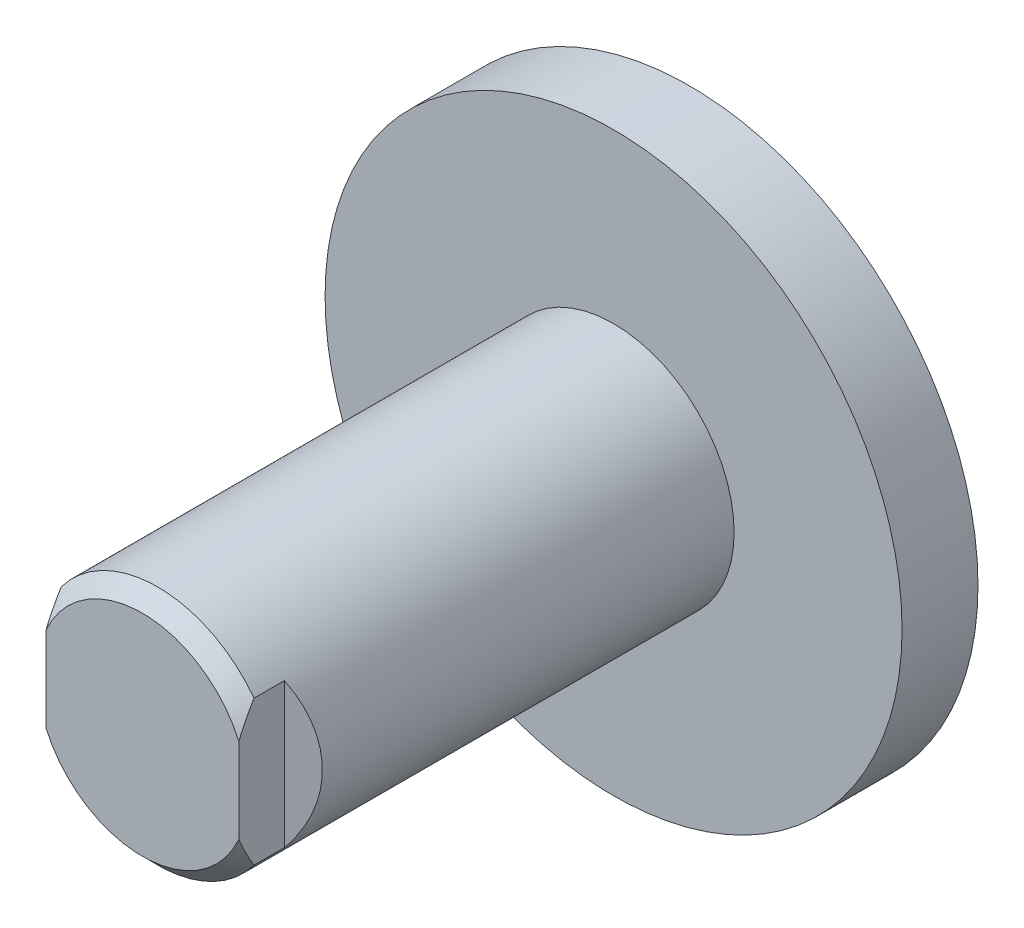
ISO-10303-21;
HEADER;
FILE_DESCRIPTION(('STEP AP214'),'2;1');
FILE_NAME('part.step','',(''),(''),'','','');
FILE_SCHEMA(('AUTOMOTIVE_DESIGN { 1 0 10303 214 1 1 1 1 }'));
ENDSEC;
DATA;
#1=APPLICATION_CONTEXT('core data for automotive mechanical design processes');
#2=APPLICATION_PROTOCOL_DEFINITION('international standard','automotive_design',2000,#1);
#3=PRODUCT_CONTEXT('',#1,'mechanical');
#4=PRODUCT('Part','Part','',(#3));
#5=PRODUCT_RELATED_PRODUCT_CATEGORY('part','',(#4));
#6=PRODUCT_DEFINITION_FORMATION('','',#4);
#7=PRODUCT_DEFINITION_CONTEXT('part definition',#1,'design');
#8=PRODUCT_DEFINITION('design','',#6,#7);
#9=PRODUCT_DEFINITION_SHAPE('','',#8);
#10=(LENGTH_UNIT() NAMED_UNIT(*) SI_UNIT(.MILLI.,.METRE.));
#11=(NAMED_UNIT(*) PLANE_ANGLE_UNIT() SI_UNIT($,.RADIAN.));
#12=(NAMED_UNIT(*) SI_UNIT($,.STERADIAN.) SOLID_ANGLE_UNIT());
#13=UNCERTAINTY_MEASURE_WITH_UNIT(LENGTH_MEASURE(1.E-05),#10,'distance_accuracy_value','');
#14=(GEOMETRIC_REPRESENTATION_CONTEXT(3) GLOBAL_UNCERTAINTY_ASSIGNED_CONTEXT((#13)) GLOBAL_UNIT_ASSIGNED_CONTEXT((#10,
#11,#12)) REPRESENTATION_CONTEXT('',''));
#15=CARTESIAN_POINT('',(0.,0.,0.));
#16=DIRECTION('',(0.,0.,1.));
#17=DIRECTION('',(1.,0.,0.));
#18=AXIS2_PLACEMENT_3D('',#15,#16,#17);
#19=CARTESIAN_POINT('',(0.,0.,36.028));
#20=DIRECTION('',(0.,0.,-1.));
#21=DIRECTION('',(-1.,0.,0.));
#22=AXIS2_PLACEMENT_3D('',#19,#20,#21);
#23=CONICAL_SURFACE('',#22,6.93750000000001,0.785398163397447);
#24=CARTESIAN_POINT('',(6.35,16.2875136785808,25.4839210715978));
#25=CARTESIAN_POINT('',(6.35,16.038699829321,25.7157353459383));
#26=CARTESIAN_POINT('',(6.35,15.7895411600218,25.9471797249323));
#27=CARTESIAN_POINT('',(6.35,15.2904267892255,26.4092107058505));
#28=CARTESIAN_POINT('',(6.35,15.0404710823884,26.6397973020049));
#29=CARTESIAN_POINT('',(6.35,14.2891413353907,27.3301907662454));
#30=CARTESIAN_POINT('',(6.35,13.7864148671968,27.7885284472054));
#31=CARTESIAN_POINT('',(6.35,12.7728274447878,28.7029853571437));
#32=CARTESIAN_POINT('',(6.35,12.2619345883602,29.1590693340857));
#33=CARTESIAN_POINT('',(6.35,11.4906737015637,29.8375432163965));
#34=CARTESIAN_POINT('',(6.35,11.2327816159887,30.0627462284449));
#35=CARTESIAN_POINT('',(6.35,10.7150320001923,30.5108776744459));
#36=CARTESIAN_POINT('',(6.35,10.4551744790402,30.733806118883));
#37=CARTESIAN_POINT('',(6.35,9.77649272816618,31.3098906516772));
#38=CARTESIAN_POINT('',(6.35,9.35584899718606,31.6609184741951));
#39=CARTESIAN_POINT('',(6.35,8.71878318362883,32.1801083902643));
#40=CARTESIAN_POINT('',(6.35,8.50537724289282,32.3519727845363));
#41=CARTESIAN_POINT('',(6.35,8.07619038561178,32.6927066917316));
#42=CARTESIAN_POINT('',(6.35,7.86040952182965,32.8615762709729));
#43=CARTESIAN_POINT('',(6.35,7.42637877070531,33.1954232195357));
#44=CARTESIAN_POINT('',(6.35,7.20813318082368,33.3604061645147));
#45=CARTESIAN_POINT('',(6.35,6.76831667735438,33.6859135195119));
#46=CARTESIAN_POINT('',(6.35,6.54674560881686,33.8464377207763));
#47=CARTESIAN_POINT('',(6.35,6.09976514084821,34.1618327397354));
#48=CARTESIAN_POINT('',(6.35,5.87435768071116,34.3167062962453));
#49=CARTESIAN_POINT('',(6.35,5.41886417025182,34.6193868262733));
#50=CARTESIAN_POINT('',(6.35,5.18877874327596,34.7671947326175));
#51=CARTESIAN_POINT('',(6.35,4.74477755368256,35.0403675353787));
#52=CARTESIAN_POINT('',(6.35,4.53136033772533,35.1665388833678));
#53=CARTESIAN_POINT('',(6.35,4.09916097803645,35.4094652463566));
#54=CARTESIAN_POINT('',(6.35,3.88037825520523,35.5262192390558));
#55=CARTESIAN_POINT('',(6.35,3.43683978608304,35.7476432552944));
#56=CARTESIAN_POINT('',(6.35,3.21208651504474,35.8523181932432));
#57=CARTESIAN_POINT('',(6.35,2.75600057303171,36.0462884448741));
#58=CARTESIAN_POINT('',(6.35,2.52466959520766,36.1355876753606));
#59=CARTESIAN_POINT('',(6.35,2.10441967881809,36.2781520285778));
#60=CARTESIAN_POINT('',(6.35,1.91673984159241,36.3350476370142));
#61=CARTESIAN_POINT('',(6.35,1.53760010890187,36.4345518111373));
#62=CARTESIAN_POINT('',(6.35,1.3461406735311,36.477162104571));
#63=CARTESIAN_POINT('',(6.35,0.960928289736163,36.5459888656755));
#64=CARTESIAN_POINT('',(6.35,0.767185378244099,36.5722606949186));
#65=CARTESIAN_POINT('',(6.35,0.378104473623389,36.6072025803939));
#66=CARTESIAN_POINT('',(6.35,0.182766584658941,36.6158737769953));
#67=CARTESIAN_POINT('',(6.35,-0.208522682761337,36.6151001222563));
#68=CARTESIAN_POINT('',(6.35,-0.404473942190867,36.6055949578497));
#69=CARTESIAN_POINT('',(6.35,-0.79470211208349,36.5689155875695));
#70=CARTESIAN_POINT('',(6.35,-0.988978893112245,36.5417400279978));
#71=CARTESIAN_POINT('',(6.35,-1.37513590408204,36.4710929882338));
#72=CARTESIAN_POINT('',(6.35,-1.5670066284985,36.427570317876));
#73=CARTESIAN_POINT('',(6.35,-1.94690603737092,36.3262682952685));
#74=CARTESIAN_POINT('',(6.35,-2.13493449709389,36.2684881116707));
#75=CARTESIAN_POINT('',(6.35,-2.52392668494941,36.134957599593));
#76=CARTESIAN_POINT('',(6.35,-2.72448692150156,36.0580423713275));
#77=CARTESIAN_POINT('',(6.35,-3.12070545432217,35.892389904449));
#78=CARTESIAN_POINT('',(6.35,-3.31636168916989,35.8036477901771));
#79=CARTESIAN_POINT('',(6.35,-3.703329426898,35.6164575687577));
#80=CARTESIAN_POINT('',(6.35,-3.89463339748388,35.5179940079799));
#81=CARTESIAN_POINT('',(6.35,-4.27299973573859,35.3133294724268));
#82=CARTESIAN_POINT('',(6.35,-4.46006261935477,35.2071294455223));
#83=CARTESIAN_POINT('',(6.35,-4.83285571275848,34.9870243818965));
#84=CARTESIAN_POINT('',(6.35,-5.01853730571334,34.8730373850988));
#85=CARTESIAN_POINT('',(6.35,-5.38655834031441,34.6398014693271));
#86=CARTESIAN_POINT('',(6.35,-5.56889770782549,34.5205524338334));
#87=CARTESIAN_POINT('',(6.35,-5.9304931327282,34.2778473642052));
#88=CARTESIAN_POINT('',(6.35,-6.10975197247163,34.1543954631431));
#89=CARTESIAN_POINT('',(6.35,-6.46574267140388,33.9039140416613));
#90=CARTESIAN_POINT('',(6.35,-6.64247456104409,33.7768845644085));
#91=CARTESIAN_POINT('',(6.35,-7.03526800028357,33.4894473701004));
#92=CARTESIAN_POINT('',(6.35,-7.25074985996656,33.3282484164257));
#93=CARTESIAN_POINT('',(6.35,-7.67888929274281,33.0021361536938));
#94=CARTESIAN_POINT('',(6.35,-7.8915467571331,32.8372227023308));
#95=CARTESIAN_POINT('',(6.35,-8.31448714661407,32.5043252678482));
#96=CARTESIAN_POINT('',(6.35,-8.52476974954855,32.3363408760525));
#97=CARTESIAN_POINT('',(6.35,-8.94328351667761,31.9978333175353));
#98=CARTESIAN_POINT('',(6.35,-9.15151464764662,31.8273101098072));
#99=CARTESIAN_POINT('',(6.35,-9.77400270901999,31.3122139192935));
#100=CARTESIAN_POINT('',(6.35,-10.1856241437372,30.9644557576852));
#101=CARTESIAN_POINT('',(6.35,-11.0036169219832,30.262821103185));
#102=CARTESIAN_POINT('',(6.35,-11.4099881026738,29.9089444213174));
#103=CARTESIAN_POINT('',(6.35,-12.1929114867335,29.2193184992231));
#104=CARTESIAN_POINT('',(6.35,-12.569713045057,28.8838519182819));
#105=CARTESIAN_POINT('',(6.35,-13.3205119247593,28.2097808477907));
#106=CARTESIAN_POINT('',(6.35,-13.6945091766494,27.8711762809455));
#107=CARTESIAN_POINT('',(6.35,-14.4393981075081,27.1922559620584));
#108=CARTESIAN_POINT('',(6.35,-14.8102948961108,26.8519458096565));
#109=CARTESIAN_POINT('',(6.35,-15.5502102709245,26.1693250218552));
#110=CARTESIAN_POINT('',(6.35,-15.9192289477531,25.8270144847183));
#111=CARTESIAN_POINT('',(6.35,-16.2875136785808,25.4839210715978));
#112=B_SPLINE_CURVE_WITH_KNOTS('',3,(#24,#25,#26,#27,#28,#29,#30,#31,#32,#33,#34,#35,#36,#37,
#38,#39,#40,#41,#42,#43,#44,#45,#46,#47,#48,#49,#50,#51,#52,#53,#54,#55,#56,#57,#58,#59,#60,#61,
#62,#63,#64,#65,#66,#67,#68,#69,#70,#71,#72,#73,#74,#75,#76,#77,#78,#79,#80,#81,#82,#83,#84,#85,
#86,#87,#88,#89,#90,#91,#92,#93,#94,#95,#96,#97,#98,#99,#100,#101,#102,#103,#104,#105,#106,#107,
#108,#109,#110,#111),.UNSPECIFIED.,.F.,.F.,(4,2,2,2,2,2,2,2,2,2,2,2,2,2,2,2,2,2,2,2,2,2,2,2,2,2,
2,2,2,2,2,2,2,2,2,2,2,2,2,2,2,2,2,4),(0.,1.0202033697665,2.04041358921686,4.08128625592998,
6.13578721730724,7.16291821623865,8.1900444785181,9.8335258846749,10.6555246052456,
11.4775051004518,12.2982240967918,13.1189814537867,13.9393355645477,14.7595810691226,
15.5031658225327,16.2468311874066,16.9901929144176,17.7333649965589,18.3212353484725,
18.9090345743392,19.4948310801572,20.0805896302035,20.6682952260422,21.2560458502851,
21.845652542485,22.4352936224741,23.0792378011829,23.7234482731973,24.3686998229871,
25.0138724491743,25.6673987859642,26.3209396013644,26.9738553081913,27.6267631403172,
28.4340267527635,29.2413213449869,30.0487241643054,30.8561400388648,32.4726189438642,
34.0891478646706,35.6026166746318,37.1161228641523,38.6262071736647,40.1362179183782),.UNSPECIFIED.);
#113=CARTESIAN_POINT('',(6.35,4.7625,35.028));
#114=VERTEX_POINT('',#113);
#115=CARTESIAN_POINT('',(6.35,2.79399467608655,36.028));
#116=VERTEX_POINT('',#115);
#117=EDGE_CURVE('E43',#114,#116,#112,.T.);
#118=ORIENTED_EDGE('',*,*,#117,.F.);
#119=CARTESIAN_POINT('',(0.,0.,35.028));
#120=DIRECTION('',(0.,0.,-1.));
#121=DIRECTION('',(-1.,0.,0.));
#122=AXIS2_PLACEMENT_3D('',#119,#120,#121);
#123=CIRCLE('',#122,7.9375);
#124=CARTESIAN_POINT('',(-6.35,4.7625,35.028));
#125=VERTEX_POINT('',#124);
#126=EDGE_CURVE('E113',#125,#114,#123,.T.);
#127=ORIENTED_EDGE('',*,*,#126,.F.);
#128=CARTESIAN_POINT('',(-6.35,-16.2875136785808,25.4839210715978));
#129=CARTESIAN_POINT('',(-6.35,-16.038699829321,25.7157353459383));
#130=CARTESIAN_POINT('',(-6.35,-15.7895411600218,25.9471797249323));
#131=CARTESIAN_POINT('',(-6.35,-15.2904267892255,26.4092107058505));
#132=CARTESIAN_POINT('',(-6.35,-15.0404710823884,26.6397973020049));
#133=CARTESIAN_POINT('',(-6.35,-14.2891413353907,27.3301907662454));
#134=CARTESIAN_POINT('',(-6.35,-13.7864148671968,27.7885284472054));
#135=CARTESIAN_POINT('',(-6.35,-12.7728274447878,28.7029853571437));
#136=CARTESIAN_POINT('',(-6.35,-12.2619345883602,29.1590693340857));
#137=CARTESIAN_POINT('',(-6.35,-11.4906737015637,29.8375432163964));
#138=CARTESIAN_POINT('',(-6.35,-11.2327816159887,30.0627462284449));
#139=CARTESIAN_POINT('',(-6.35,-10.7150320001923,30.5108776744459));
#140=CARTESIAN_POINT('',(-6.35,-10.4551744790402,30.7338061188829));
#141=CARTESIAN_POINT('',(-6.35,-9.77649272816619,31.3098906516772));
#142=CARTESIAN_POINT('',(-6.35,-9.35584899718607,31.6609184741951));
#143=CARTESIAN_POINT('',(-6.35,-8.71878318362885,32.1801083902643));
#144=CARTESIAN_POINT('',(-6.35,-8.50537724289284,32.3519727845363));
#145=CARTESIAN_POINT('',(-6.35,-8.0761903856118,32.6927066917316));
#146=CARTESIAN_POINT('',(-6.35,-7.86040952182968,32.8615762709729));
#147=CARTESIAN_POINT('',(-6.35,-7.42637877070534,33.1954232195357));
#148=CARTESIAN_POINT('',(-6.35,-7.20813318082371,33.3604061645147));
#149=CARTESIAN_POINT('',(-6.35,-6.76831667735441,33.6859135195118));
#150=CARTESIAN_POINT('',(-6.35,-6.54674560881689,33.8464377207763));
#151=CARTESIAN_POINT('',(-6.35,-6.09976514084825,34.1618327397354));
#152=CARTESIAN_POINT('',(-6.35,-5.87435768071121,34.3167062962453));
#153=CARTESIAN_POINT('',(-6.35,-5.41886417025187,34.6193868262732));
#154=CARTESIAN_POINT('',(-6.35,-5.18877874327601,34.7671947326175));
#155=CARTESIAN_POINT('',(-6.35,-4.74477755368262,35.0403675353786));
#156=CARTESIAN_POINT('',(-6.35,-4.53136033772538,35.1665388833678));
#157=CARTESIAN_POINT('',(-6.35,-4.09916097803651,35.4094652463566));
#158=CARTESIAN_POINT('',(-6.35,-3.88037825520528,35.5262192390558));
#159=CARTESIAN_POINT('',(-6.35,-3.43683978608309,35.7476432552944));
#160=CARTESIAN_POINT('',(-6.35,-3.21208651504479,35.8523181932432));
#161=CARTESIAN_POINT('',(-6.35,-2.75600057303176,36.0462884448741));
#162=CARTESIAN_POINT('',(-6.35,-2.52466959520771,36.1355876753606));
#163=CARTESIAN_POINT('',(-6.35,-2.10441967881813,36.2781520285778));
#164=CARTESIAN_POINT('',(-6.35,-1.91673984159246,36.3350476370142));
#165=CARTESIAN_POINT('',(-6.35,-1.53760010890192,36.4345518111373));
#166=CARTESIAN_POINT('',(-6.35,-1.34614067353114,36.4771621045709));
#167=CARTESIAN_POINT('',(-6.35,-0.9609282897362,36.5459888656755));
#168=CARTESIAN_POINT('',(-6.35,-0.767185378244136,36.5722606949186));
#169=CARTESIAN_POINT('',(-6.35,-0.378104473623426,36.6072025803939));
#170=CARTESIAN_POINT('',(-6.35,-0.182766584658978,36.6158737769953));
#171=CARTESIAN_POINT('',(-6.35,0.2085226827613,36.6151001222563));
#172=CARTESIAN_POINT('',(-6.35,0.404473942190831,36.6055949578497));
#173=CARTESIAN_POINT('',(-6.35,0.794702112083457,36.5689155875695));
#174=CARTESIAN_POINT('',(-6.35,0.988978893112213,36.5417400279978));
#175=CARTESIAN_POINT('',(-6.35,1.37513590408201,36.4710929882338));
#176=CARTESIAN_POINT('',(-6.35,1.56700662849848,36.427570317876));
#177=CARTESIAN_POINT('',(-6.35,1.9469060373709,36.3262682952686));
#178=CARTESIAN_POINT('',(-6.35,2.13493449709386,36.2684881116707));
#179=CARTESIAN_POINT('',(-6.35,2.52392668494938,36.134957599593));
#180=CARTESIAN_POINT('',(-6.35,2.72448692150153,36.0580423713275));
#181=CARTESIAN_POINT('',(-6.35,3.12070545432214,35.892389904449));
#182=CARTESIAN_POINT('',(-6.35,3.31636168916986,35.8036477901771));
#183=CARTESIAN_POINT('',(-6.35,3.70332942689797,35.6164575687577));
#184=CARTESIAN_POINT('',(-6.35,3.89463339748385,35.5179940079799));
#185=CARTESIAN_POINT('',(-6.35,4.27299973573855,35.3133294724268));
#186=CARTESIAN_POINT('',(-6.35,4.46006261935472,35.2071294455223));
#187=CARTESIAN_POINT('',(-6.35,4.83285571275843,34.9870243818965));
#188=CARTESIAN_POINT('',(-6.35,5.01853730571329,34.8730373850988));
#189=CARTESIAN_POINT('',(-6.35,5.38655834031436,34.6398014693272));
#190=CARTESIAN_POINT('',(-6.35,5.56889770782544,34.5205524338334));
#191=CARTESIAN_POINT('',(-6.35,5.93049313272815,34.2778473642052));
#192=CARTESIAN_POINT('',(-6.35,6.10975197247157,34.1543954631432));
#193=CARTESIAN_POINT('',(-6.35,6.46574267140382,33.9039140416614));
#194=CARTESIAN_POINT('',(-6.35,6.64247456104403,33.7768845644086));
#195=CARTESIAN_POINT('',(-6.35,7.03526800028351,33.4894473701005));
#196=CARTESIAN_POINT('',(-6.35,7.2507498599665,33.3282484164258));
#197=CARTESIAN_POINT('',(-6.35,7.67888929274275,33.0021361536939));
#198=CARTESIAN_POINT('',(-6.35,7.89154675713304,32.8372227023309));
#199=CARTESIAN_POINT('',(-6.35,8.31448714661401,32.5043252678483));
#200=CARTESIAN_POINT('',(-6.35,8.5247697495485,32.3363408760526));
#201=CARTESIAN_POINT('',(-6.35,8.94328351667757,31.9978333175354));
#202=CARTESIAN_POINT('',(-6.35,9.15151464764657,31.8273101098072));
#203=CARTESIAN_POINT('',(-6.35,9.77400270901994,31.3122139192935));
#204=CARTESIAN_POINT('',(-6.35,10.1856241437372,30.9644557576852));
#205=CARTESIAN_POINT('',(-6.35,11.0036169219832,30.262821103185));
#206=CARTESIAN_POINT('',(-6.35,11.4099881026738,29.9089444213175));
#207=CARTESIAN_POINT('',(-6.35,12.1929114867335,29.2193184992232));
#208=CARTESIAN_POINT('',(-6.35,12.569713045057,28.883851918282));
#209=CARTESIAN_POINT('',(-6.35,13.3205119247593,28.2097808477908));
#210=CARTESIAN_POINT('',(-6.35,13.6945091766493,27.8711762809455));
#211=CARTESIAN_POINT('',(-6.35,14.4393981075081,27.1922559620585));
#212=CARTESIAN_POINT('',(-6.35,14.8102948961108,26.8519458096565));
#213=CARTESIAN_POINT('',(-6.35,15.5502102709245,26.1693250218552));
#214=CARTESIAN_POINT('',(-6.35,15.9192289477531,25.8270144847183));
#215=CARTESIAN_POINT('',(-6.35,16.2875136785808,25.4839210715978));
#216=B_SPLINE_CURVE_WITH_KNOTS('',3,(#128,#129,#130,#131,#132,#133,#134,#135,#136,#137,#138,
#139,#140,#141,#142,#143,#144,#145,#146,#147,#148,#149,#150,#151,#152,#153,#154,#155,#156,#157,
#158,#159,#160,#161,#162,#163,#164,#165,#166,#167,#168,#169,#170,#171,#172,#173,#174,#175,#176,
#177,#178,#179,#180,#181,#182,#183,#184,#185,#186,#187,#188,#189,#190,#191,#192,#193,#194,#195,
#196,#197,#198,#199,#200,#201,#202,#203,#204,#205,#206,#207,#208,#209,#210,#211,#212,#213,#214,
#215),.UNSPECIFIED.,.F.,.F.,(4,2,2,2,2,2,2,2,2,2,2,2,2,2,2,2,2,2,2,2,2,2,2,2,2,2,2,2,2,2,2,2,2,
2,2,2,2,2,2,2,2,2,2,4),(0.,1.0202033697665,2.04041358921686,4.08128625592997,6.13578721730723,
7.16291821623864,8.19004447851809,9.83352588467488,10.6555246052456,11.4775051004517,
12.2982240967918,13.1189814537867,13.9393355645477,14.7595810691225,15.5031658225326,
16.2468311874066,16.9901929144175,17.7333649965588,18.3212353484725,18.9090345743391,
19.4948310801572,20.0805896302034,20.6682952260422,21.256045850285,21.845652542485,
22.4352936224741,23.0792378011828,23.7234482731973,24.368699822987,25.0138724491742,
25.6673987859641,26.3209396013644,26.9738553081912,27.6267631403172,28.4340267527635,
29.2413213449868,30.0487241643053,30.8561400388647,32.4726189438642,34.0891478646705,
35.6026166746318,37.1161228641523,38.6262071736647,40.1362179183782),.UNSPECIFIED.);
#217=CARTESIAN_POINT('',(-6.35000000000002,2.79399467608652,36.028));
#218=VERTEX_POINT('',#217);
#219=EDGE_CURVE('E102',#218,#125,#216,.T.);
#220=ORIENTED_EDGE('',*,*,#219,.F.);
#221=CARTESIAN_POINT('',(0.,0.,36.028));
#222=DIRECTION('',(0.,0.,-1.));
#223=DIRECTION('',(-1.,0.,0.));
#224=AXIS2_PLACEMENT_3D('',#221,#222,#223);
#225=CIRCLE('',#224,6.93750000000001);
#226=EDGE_CURVE('E57',#116,#218,#225,.F.);
#227=ORIENTED_EDGE('',*,*,#226,.F.);
#228=EDGE_LOOP('',(#118,#127,#220,#227));
#229=FACE_BOUND('',#228,.T.);
#230=ADVANCED_FACE('F34',(#229),#23,.T.);
#231=CARTESIAN_POINT('',(0.,0.,5.));
#232=DIRECTION('',(0.,0.,-1.));
#233=DIRECTION('',(-1.,0.,0.));
#234=AXIS2_PLACEMENT_3D('',#231,#232,#233);
#235=CYLINDRICAL_SURFACE('',#234,19.);
#236=CARTESIAN_POINT('',(0.,0.,5.));
#237=DIRECTION('',(0.,0.,1.));
#238=DIRECTION('',(1.,0.,0.));
#239=AXIS2_PLACEMENT_3D('',#236,#237,#238);
#240=CIRCLE('',#239,19.);
#241=CARTESIAN_POINT('',(19.,0.,5.));
#242=VERTEX_POINT('',#241);
#243=EDGE_CURVE('E107',#242,#242,#240,.T.);
#244=ORIENTED_EDGE('',*,*,#243,.F.);
#245=EDGE_LOOP('',(#244));
#246=FACE_BOUND('',#245,.T.);
#247=CARTESIAN_POINT('',(0.,0.,0.));
#248=DIRECTION('',(0.,0.,1.));
#249=DIRECTION('',(1.,0.,0.));
#250=AXIS2_PLACEMENT_3D('',#247,#248,#249);
#251=CIRCLE('',#250,19.);
#252=CARTESIAN_POINT('',(19.,0.,0.));
#253=VERTEX_POINT('',#252);
#254=EDGE_CURVE('E111',#253,#253,#251,.T.);
#255=ORIENTED_EDGE('',*,*,#254,.T.);
#256=EDGE_LOOP('',(#255));
#257=FACE_BOUND('',#256,.T.);
#258=ADVANCED_FACE('F144',(#246,#257),#235,.T.);
#259=CARTESIAN_POINT('',(0.,0.,5.));
#260=DIRECTION('',(0.,0.,1.));
#261=DIRECTION('',(1.,0.,0.));
#262=AXIS2_PLACEMENT_3D('',#259,#260,#261);
#263=PLANE('',#262);
#264=CARTESIAN_POINT('',(0.,0.,5.));
#265=DIRECTION('',(0.,0.,1.));
#266=DIRECTION('',(1.,0.,0.));
#267=AXIS2_PLACEMENT_3D('',#264,#265,#266);
#268=CIRCLE('',#267,7.9375);
#269=CARTESIAN_POINT('',(7.9375,0.,5.));
#270=VERTEX_POINT('',#269);
#271=EDGE_CURVE('E103',#270,#270,#268,.T.);
#272=ORIENTED_EDGE('',*,*,#271,.F.);
#273=EDGE_LOOP('',(#272));
#274=FACE_BOUND('',#273,.T.);
#275=ORIENTED_EDGE('',*,*,#243,.T.);
#276=EDGE_LOOP('',(#275));
#277=FACE_BOUND('',#276,.T.);
#278=ADVANCED_FACE('F141',(#274,#277),#263,.T.);
#279=CARTESIAN_POINT('',(0.,0.,0.));
#280=DIRECTION('',(0.,0.,1.));
#281=DIRECTION('',(1.,0.,0.));
#282=AXIS2_PLACEMENT_3D('',#279,#280,#281);
#283=PLANE('',#282);
#284=ORIENTED_EDGE('',*,*,#254,.F.);
#285=EDGE_LOOP('',(#284));
#286=FACE_BOUND('',#285,.T.);
#287=ADVANCED_FACE('F139',(#286),#283,.F.);
#288=CARTESIAN_POINT('',(0.,0.,58.4786403026729));
#289=DIRECTION('',(0.,0.,-1.));
#290=DIRECTION('',(-1.,0.,0.));
#291=AXIS2_PLACEMENT_3D('',#288,#289,#290);
#292=CYLINDRICAL_SURFACE('',#291,7.9375);
#293=DIRECTION('',(0.,0.,-1.));
#294=VECTOR('',#293,1.);
#295=CARTESIAN_POINT('',(6.35,4.76249999999999,58.4786403026729));
#296=LINE('',#295,#294);
#297=CARTESIAN_POINT('',(6.35,4.7625,33.028));
#298=VERTEX_POINT('',#297);
#299=EDGE_CURVE('E89',#298,#114,#296,.F.);
#300=ORIENTED_EDGE('',*,*,#299,.F.);
#301=CARTESIAN_POINT('',(0.,0.,36.6941742093542));
#302=DIRECTION('',(-0.500000000000004,0.,-0.866025403784437));
#303=DIRECTION('',(0.866025403784436,0.,-0.500000000000004));
#304=AXIS2_PLACEMENT_3D('',#301,#302,#303);
#305=ELLIPSE('',#304,9.16543552338533,7.9375);
#306=CARTESIAN_POINT('',(6.35,-4.7625,33.028));
#307=VERTEX_POINT('',#306);
#308=EDGE_CURVE('E12',#307,#298,#305,.F.);
#309=ORIENTED_EDGE('',*,*,#308,.F.);
#310=DIRECTION('',(0.,0.,-1.));
#311=VECTOR('',#310,1.);
#312=CARTESIAN_POINT('',(6.35,-4.76249999999999,58.4786403026729));
#313=LINE('',#312,#311);
#314=CARTESIAN_POINT('',(6.35,-4.7625,35.028));
#315=VERTEX_POINT('',#314);
#316=EDGE_CURVE('E98',#315,#307,#313,.T.);
#317=ORIENTED_EDGE('',*,*,#316,.F.);
#318=CARTESIAN_POINT('',(-6.35,-4.7625,35.028));
#319=VERTEX_POINT('',#318);
#320=EDGE_CURVE('E105',#315,#319,#123,.T.);
#321=ORIENTED_EDGE('',*,*,#320,.T.);
#322=DIRECTION('',(0.,0.,-1.));
#323=VECTOR('',#322,1.);
#324=CARTESIAN_POINT('',(-6.35,-4.7625,58.4786403026729));
#325=LINE('',#324,#323);
#326=CARTESIAN_POINT('',(-6.35,-4.7625,33.028));
#327=VERTEX_POINT('',#326);
#328=EDGE_CURVE('E158',#327,#319,#325,.F.);
#329=ORIENTED_EDGE('',*,*,#328,.F.);
#330=CARTESIAN_POINT('',(0.,0.,36.6941742093542));
#331=DIRECTION('',(0.500000000000003,0.,-0.866025403784437));
#332=DIRECTION('',(-0.866025403784437,0.,-0.500000000000003));
#333=AXIS2_PLACEMENT_3D('',#330,#331,#332);
#334=ELLIPSE('',#333,9.16543552338533,7.9375);
#335=CARTESIAN_POINT('',(-6.35,4.7625,33.028));
#336=VERTEX_POINT('',#335);
#337=EDGE_CURVE('E121',#336,#327,#334,.F.);
#338=ORIENTED_EDGE('',*,*,#337,.F.);
#339=DIRECTION('',(0.,0.,-1.));
#340=VECTOR('',#339,1.);
#341=CARTESIAN_POINT('',(-6.35,4.7625,58.4786403026729));
#342=LINE('',#341,#340);
#343=EDGE_CURVE('E160',#125,#336,#342,.T.);
#344=ORIENTED_EDGE('',*,*,#343,.F.);
#345=ORIENTED_EDGE('',*,*,#126,.T.);
#346=EDGE_LOOP('',(#300,#309,#317,#321,#329,#338,#344,#345));
#347=FACE_BOUND('',#346,.T.);
#348=ORIENTED_EDGE('',*,*,#271,.T.);
#349=EDGE_LOOP('',(#348));
#350=FACE_BOUND('',#349,.T.);
#351=ADVANCED_FACE('F136',(#347,#350),#292,.T.);
#352=CARTESIAN_POINT('',(0.,0.,36.028));
#353=DIRECTION('',(0.,0.,-1.));
#354=DIRECTION('',(-1.,0.,0.));
#355=AXIS2_PLACEMENT_3D('',#352,#353,#354);
#356=PLANE('',#355);
#357=CARTESIAN_POINT('',(-6.35,-2.79399467608651,36.028));
#358=VERTEX_POINT('',#357);
#359=CARTESIAN_POINT('',(6.35,-2.79399467608657,36.028));
#360=VERTEX_POINT('',#359);
#361=EDGE_CURVE('E97',#358,#360,#225,.F.);
#362=ORIENTED_EDGE('',*,*,#361,.T.);
#363=DIRECTION('',(0.,1.,0.));
#364=VECTOR('',#363,1.);
#365=CARTESIAN_POINT('',(6.35,-19.,36.028));
#366=LINE('',#365,#364);
#367=EDGE_CURVE('E50',#360,#116,#366,.T.);
#368=ORIENTED_EDGE('',*,*,#367,.T.);
#369=ORIENTED_EDGE('',*,*,#226,.T.);
#370=DIRECTION('',(0.,1.,0.));
#371=VECTOR('',#370,1.);
#372=CARTESIAN_POINT('',(-6.35,-19.,36.028));
#373=LINE('',#372,#371);
#374=EDGE_CURVE('E168',#358,#218,#373,.T.);
#375=ORIENTED_EDGE('',*,*,#374,.F.);
#376=EDGE_LOOP('',(#362,#368,#369,#375));
#377=FACE_BOUND('',#376,.T.);
#378=ADVANCED_FACE('F95',(#377),#356,.F.);
#379=EDGE_CURVE('E93',#360,#315,#112,.T.);
#380=ORIENTED_EDGE('',*,*,#379,.F.);
#381=ORIENTED_EDGE('',*,*,#361,.F.);
#382=EDGE_CURVE('E120',#319,#358,#216,.T.);
#383=ORIENTED_EDGE('',*,*,#382,.F.);
#384=ORIENTED_EDGE('',*,*,#320,.F.);
#385=EDGE_LOOP('',(#380,#381,#383,#384));
#386=FACE_BOUND('',#385,.T.);
#387=ADVANCED_FACE('F36',(#386),#23,.T.);
#388=CARTESIAN_POINT('',(-6.35,-19.,33.028));
#389=DIRECTION('',(0.500000000000003,0.,-0.866025403784437));
#390=DIRECTION('',(-0.866025403784437,0.,-0.500000000000003));
#391=AXIS2_PLACEMENT_3D('',#388,#389,#390);
#392=PLANE('',#391);
#393=ORIENTED_EDGE('',*,*,#337,.T.);
#394=DIRECTION('',(0.,1.,0.));
#395=VECTOR('',#394,1.);
#396=CARTESIAN_POINT('',(-6.35,-19.,33.028));
#397=LINE('',#396,#395);
#398=EDGE_CURVE('E165',#327,#336,#397,.T.);
#399=ORIENTED_EDGE('',*,*,#398,.T.);
#400=EDGE_LOOP('',(#393,#399));
#401=FACE_BOUND('',#400,.T.);
#402=ADVANCED_FACE('F128',(#401),#392,.F.);
#403=CARTESIAN_POINT('',(-6.35,-19.,36.028));
#404=DIRECTION('',(1.,0.,0.));
#405=DIRECTION('',(0.,0.,-1.));
#406=AXIS2_PLACEMENT_3D('',#403,#404,#405);
#407=PLANE('',#406);
#408=ORIENTED_EDGE('',*,*,#328,.T.);
#409=ORIENTED_EDGE('',*,*,#382,.T.);
#410=ORIENTED_EDGE('',*,*,#374,.T.);
#411=ORIENTED_EDGE('',*,*,#219,.T.);
#412=ORIENTED_EDGE('',*,*,#343,.T.);
#413=ORIENTED_EDGE('',*,*,#398,.F.);
#414=EDGE_LOOP('',(#408,#409,#410,#411,#412,#413));
#415=FACE_BOUND('',#414,.T.);
#416=ADVANCED_FACE('F122',(#415),#407,.F.);
#417=CARTESIAN_POINT('',(6.35,-19.,33.028));
#418=DIRECTION('',(-0.500000000000004,0.,-0.866025403784437));
#419=DIRECTION('',(-0.866025403784436,0.,0.500000000000004));
#420=AXIS2_PLACEMENT_3D('',#417,#418,#419);
#421=PLANE('',#420);
#422=ORIENTED_EDGE('',*,*,#308,.T.);
#423=DIRECTION('',(0.,1.,0.));
#424=VECTOR('',#423,1.);
#425=CARTESIAN_POINT('',(6.35,-19.,33.028));
#426=LINE('',#425,#424);
#427=EDGE_CURVE('E99',#307,#298,#426,.T.);
#428=ORIENTED_EDGE('',*,*,#427,.F.);
#429=EDGE_LOOP('',(#422,#428));
#430=FACE_BOUND('',#429,.T.);
#431=ADVANCED_FACE('F127',(#430),#421,.F.);
#432=CARTESIAN_POINT('',(6.35,-19.,36.028));
#433=DIRECTION('',(-1.,0.,0.));
#434=DIRECTION('',(0.,0.,1.));
#435=AXIS2_PLACEMENT_3D('',#432,#433,#434);
#436=PLANE('',#435);
#437=ORIENTED_EDGE('',*,*,#299,.T.);
#438=ORIENTED_EDGE('',*,*,#117,.T.);
#439=ORIENTED_EDGE('',*,*,#367,.F.);
#440=ORIENTED_EDGE('',*,*,#379,.T.);
#441=ORIENTED_EDGE('',*,*,#316,.T.);
#442=ORIENTED_EDGE('',*,*,#427,.T.);
#443=EDGE_LOOP('',(#437,#438,#439,#440,#441,#442));
#444=FACE_BOUND('',#443,.T.);
#445=ADVANCED_FACE('F86',(#444),#436,.F.);
#446=CLOSED_SHELL('',(#230,#258,#278,#287,#351,#378,#387,#402,#416,#431,#445));
#447=MANIFOLD_SOLID_BREP('B2',#446);
#448=ADVANCED_BREP_SHAPE_REPRESENTATION('',(#18,#447),#14);
#449=SHAPE_DEFINITION_REPRESENTATION(#9,#448);
ENDSEC;
END-ISO-10303-21;
